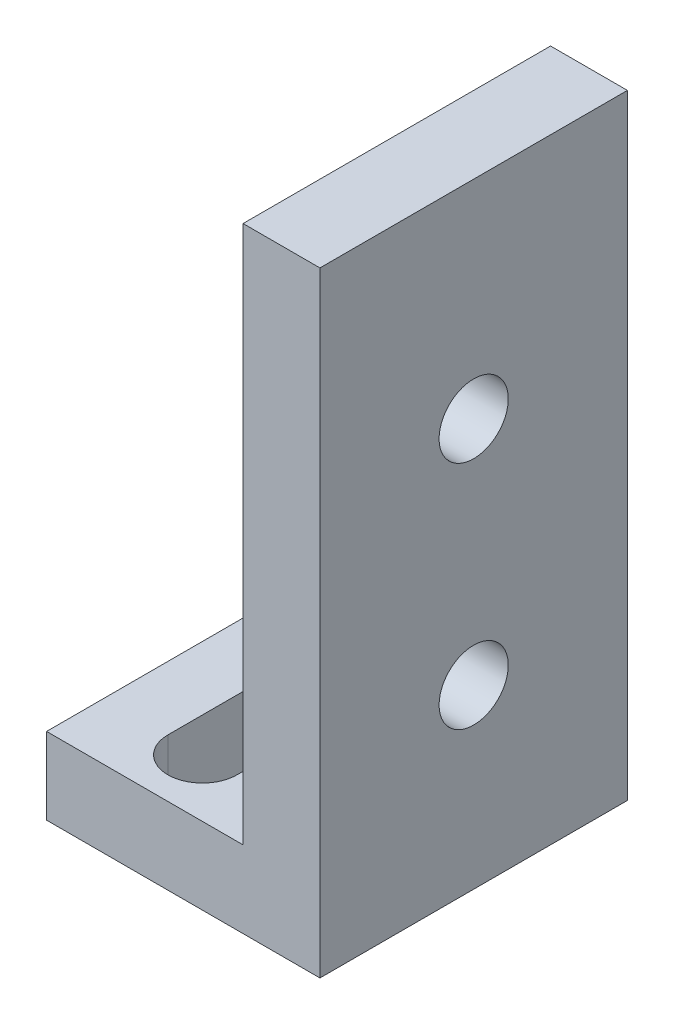
ISO-10303-21;
HEADER;
FILE_DESCRIPTION(('STEP AP214'),'2;1');
FILE_NAME('part.step','',(''),(''),'','','');
FILE_SCHEMA(('AUTOMOTIVE_DESIGN { 1 0 10303 214 1 1 1 1 }'));
ENDSEC;
DATA;
#1=APPLICATION_CONTEXT('core data for automotive mechanical design processes');
#2=APPLICATION_PROTOCOL_DEFINITION('international standard','automotive_design',2000,#1);
#3=PRODUCT_CONTEXT('',#1,'mechanical');
#4=PRODUCT('Part','Part','',(#3));
#5=PRODUCT_RELATED_PRODUCT_CATEGORY('part','',(#4));
#6=PRODUCT_DEFINITION_FORMATION('','',#4);
#7=PRODUCT_DEFINITION_CONTEXT('part definition',#1,'design');
#8=PRODUCT_DEFINITION('design','',#6,#7);
#9=PRODUCT_DEFINITION_SHAPE('','',#8);
#10=(LENGTH_UNIT() NAMED_UNIT(*) SI_UNIT(.MILLI.,.METRE.));
#11=(NAMED_UNIT(*) PLANE_ANGLE_UNIT() SI_UNIT($,.RADIAN.));
#12=(NAMED_UNIT(*) SI_UNIT($,.STERADIAN.) SOLID_ANGLE_UNIT());
#13=UNCERTAINTY_MEASURE_WITH_UNIT(LENGTH_MEASURE(1.E-05),#10,'distance_accuracy_value','');
#14=(GEOMETRIC_REPRESENTATION_CONTEXT(3) GLOBAL_UNCERTAINTY_ASSIGNED_CONTEXT((#13)) GLOBAL_UNIT_ASSIGNED_CONTEXT((#10,
#11,#12)) REPRESENTATION_CONTEXT('',''));
#15=CARTESIAN_POINT('',(0.,0.,0.));
#16=DIRECTION('',(0.,0.,1.));
#17=DIRECTION('',(1.,0.,0.));
#18=AXIS2_PLACEMENT_3D('',#15,#16,#17);
#19=CARTESIAN_POINT('',(17.78,0.,20.));
#20=DIRECTION('',(0.,1.,0.));
#21=DIRECTION('',(-1.,0.,0.));
#22=AXIS2_PLACEMENT_3D('',#19,#20,#21);
#23=PLANE('',#22);
#24=DIRECTION('',(0.,0.,-1.));
#25=VECTOR('',#24,1.);
#26=CARTESIAN_POINT('',(8.63999999999999,0.,3.75));
#27=LINE('',#26,#25);
#28=CARTESIAN_POINT('',(8.64,0.,16.25));
#29=VERTEX_POINT('',#28);
#30=CARTESIAN_POINT('',(8.63999999999999,0.,3.75));
#31=VERTEX_POINT('',#30);
#32=EDGE_CURVE('E127',#29,#31,#27,.T.);
#33=ORIENTED_EDGE('',*,*,#32,.T.);
#34=CARTESIAN_POINT('',(6.39,0.,3.75));
#35=DIRECTION('',(0.,1.,0.));
#36=DIRECTION('',(0.,0.,1.));
#37=AXIS2_PLACEMENT_3D('',#34,#35,#36);
#38=CIRCLE('',#37,2.25);
#39=CARTESIAN_POINT('',(4.14,0.,3.75));
#40=VERTEX_POINT('',#39);
#41=EDGE_CURVE('E120',#31,#40,#38,.T.);
#42=ORIENTED_EDGE('',*,*,#41,.T.);
#43=DIRECTION('',(0.,0.,1.));
#44=VECTOR('',#43,1.);
#45=CARTESIAN_POINT('',(4.14,0.,3.75));
#46=LINE('',#45,#44);
#47=CARTESIAN_POINT('',(4.14000000000001,0.,16.25));
#48=VERTEX_POINT('',#47);
#49=EDGE_CURVE('E130',#40,#48,#46,.T.);
#50=ORIENTED_EDGE('',*,*,#49,.T.);
#51=CARTESIAN_POINT('',(6.39,0.,16.25));
#52=DIRECTION('',(0.,1.,0.));
#53=DIRECTION('',(0.,0.,1.));
#54=AXIS2_PLACEMENT_3D('',#51,#52,#53);
#55=CIRCLE('',#54,2.25);
#56=EDGE_CURVE('E56',#48,#29,#55,.T.);
#57=ORIENTED_EDGE('',*,*,#56,.T.);
#58=EDGE_LOOP('',(#33,#42,#50,#57));
#59=FACE_BOUND('',#58,.T.);
#60=DIRECTION('',(1.,0.,0.));
#61=VECTOR('',#60,1.);
#62=CARTESIAN_POINT('',(17.78,0.,0.));
#63=LINE('',#62,#61);
#64=CARTESIAN_POINT('',(0.,0.,0.));
#65=VERTEX_POINT('',#64);
#66=CARTESIAN_POINT('',(17.78,0.,0.));
#67=VERTEX_POINT('',#66);
#68=EDGE_CURVE('E164',#65,#67,#63,.T.);
#69=ORIENTED_EDGE('',*,*,#68,.T.);
#70=DIRECTION('',(0.,0.,-1.));
#71=VECTOR('',#70,1.);
#72=CARTESIAN_POINT('',(17.78,0.,20.));
#73=LINE('',#72,#71);
#74=CARTESIAN_POINT('',(17.78,0.,20.));
#75=VERTEX_POINT('',#74);
#76=EDGE_CURVE('E11',#75,#67,#73,.T.);
#77=ORIENTED_EDGE('',*,*,#76,.F.);
#78=DIRECTION('',(1.,0.,0.));
#79=VECTOR('',#78,1.);
#80=CARTESIAN_POINT('',(17.78,0.,20.));
#81=LINE('',#80,#79);
#82=CARTESIAN_POINT('',(0.,0.,20.));
#83=VERTEX_POINT('',#82);
#84=EDGE_CURVE('E170',#83,#75,#81,.T.);
#85=ORIENTED_EDGE('',*,*,#84,.F.);
#86=DIRECTION('',(0.,0.,-1.));
#87=VECTOR('',#86,1.);
#88=CARTESIAN_POINT('',(0.,0.,20.));
#89=LINE('',#88,#87);
#90=EDGE_CURVE('E190',#83,#65,#89,.T.);
#91=ORIENTED_EDGE('',*,*,#90,.T.);
#92=EDGE_LOOP('',(#69,#77,#85,#91));
#93=FACE_BOUND('',#92,.T.);
#94=ADVANCED_FACE('F41',(#59,#93),#23,.F.);
#95=CARTESIAN_POINT('',(17.78,40.,20.));
#96=DIRECTION('',(-1.,0.,0.));
#97=DIRECTION('',(0.,-1.,0.));
#98=AXIS2_PLACEMENT_3D('',#95,#96,#97);
#99=PLANE('',#98);
#100=CARTESIAN_POINT('',(17.78,26.5,10.));
#101=DIRECTION('',(-1.,0.,0.));
#102=DIRECTION('',(0.,0.,1.));
#103=AXIS2_PLACEMENT_3D('',#100,#101,#102);
#104=CIRCLE('',#103,2.25);
#105=CARTESIAN_POINT('',(17.78,26.5,12.25));
#106=VERTEX_POINT('',#105);
#107=EDGE_CURVE('E155',#106,#106,#104,.T.);
#108=ORIENTED_EDGE('',*,*,#107,.T.);
#109=EDGE_LOOP('',(#108));
#110=FACE_BOUND('',#109,.T.);
#111=CARTESIAN_POINT('',(17.78,11.5,10.));
#112=DIRECTION('',(-1.,0.,0.));
#113=DIRECTION('',(0.,0.,1.));
#114=AXIS2_PLACEMENT_3D('',#111,#112,#113);
#115=CIRCLE('',#114,2.25);
#116=CARTESIAN_POINT('',(17.78,11.5,12.25));
#117=VERTEX_POINT('',#116);
#118=EDGE_CURVE('E288',#117,#117,#115,.T.);
#119=ORIENTED_EDGE('',*,*,#118,.T.);
#120=EDGE_LOOP('',(#119));
#121=FACE_BOUND('',#120,.T.);
#122=DIRECTION('',(0.,1.,0.));
#123=VECTOR('',#122,1.);
#124=CARTESIAN_POINT('',(17.78,40.,0.));
#125=LINE('',#124,#123);
#126=CARTESIAN_POINT('',(17.78,40.,0.));
#127=VERTEX_POINT('',#126);
#128=EDGE_CURVE('E194',#67,#127,#125,.T.);
#129=ORIENTED_EDGE('',*,*,#128,.T.);
#130=DIRECTION('',(0.,0.,-1.));
#131=VECTOR('',#130,1.);
#132=CARTESIAN_POINT('',(17.78,40.,20.));
#133=LINE('',#132,#131);
#134=CARTESIAN_POINT('',(17.78,40.,20.));
#135=VERTEX_POINT('',#134);
#136=EDGE_CURVE('E49',#135,#127,#133,.T.);
#137=ORIENTED_EDGE('',*,*,#136,.F.);
#138=DIRECTION('',(0.,1.,0.));
#139=VECTOR('',#138,1.);
#140=CARTESIAN_POINT('',(17.78,40.,20.));
#141=LINE('',#140,#139);
#142=EDGE_CURVE('E174',#75,#135,#141,.T.);
#143=ORIENTED_EDGE('',*,*,#142,.F.);
#144=ORIENTED_EDGE('',*,*,#76,.T.);
#145=EDGE_LOOP('',(#129,#137,#143,#144));
#146=FACE_BOUND('',#145,.T.);
#147=ADVANCED_FACE('F251',(#110,#121,#146),#99,.F.);
#148=CARTESIAN_POINT('',(12.78,40.,20.));
#149=DIRECTION('',(0.,-1.,0.));
#150=DIRECTION('',(0.,0.,-1.));
#151=AXIS2_PLACEMENT_3D('',#148,#149,#150);
#152=PLANE('',#151);
#153=DIRECTION('',(-1.,0.,0.));
#154=VECTOR('',#153,1.);
#155=CARTESIAN_POINT('',(12.78,40.,0.));
#156=LINE('',#155,#154);
#157=CARTESIAN_POINT('',(12.78,40.,0.));
#158=VERTEX_POINT('',#157);
#159=EDGE_CURVE('E197',#127,#158,#156,.T.);
#160=ORIENTED_EDGE('',*,*,#159,.T.);
#161=DIRECTION('',(0.,0.,-1.));
#162=VECTOR('',#161,1.);
#163=CARTESIAN_POINT('',(12.78,40.,20.));
#164=LINE('',#163,#162);
#165=CARTESIAN_POINT('',(12.78,40.,20.));
#166=VERTEX_POINT('',#165);
#167=EDGE_CURVE('E219',#166,#158,#164,.T.);
#168=ORIENTED_EDGE('',*,*,#167,.F.);
#169=DIRECTION('',(-1.,0.,0.));
#170=VECTOR('',#169,1.);
#171=CARTESIAN_POINT('',(12.78,40.,20.));
#172=LINE('',#171,#170);
#173=EDGE_CURVE('E178',#135,#166,#172,.T.);
#174=ORIENTED_EDGE('',*,*,#173,.F.);
#175=ORIENTED_EDGE('',*,*,#136,.T.);
#176=EDGE_LOOP('',(#160,#168,#174,#175));
#177=FACE_BOUND('',#176,.T.);
#178=ADVANCED_FACE('F228',(#177),#152,.F.);
#179=CARTESIAN_POINT('',(12.78,5.,20.));
#180=DIRECTION('',(1.,0.,0.));
#181=DIRECTION('',(0.,0.,-1.));
#182=AXIS2_PLACEMENT_3D('',#179,#180,#181);
#183=PLANE('',#182);
#184=CARTESIAN_POINT('',(12.78,26.5,10.));
#185=DIRECTION('',(-1.,0.,0.));
#186=DIRECTION('',(0.,0.,1.));
#187=AXIS2_PLACEMENT_3D('',#184,#185,#186);
#188=CIRCLE('',#187,2.25);
#189=CARTESIAN_POINT('',(12.78,26.5,12.25));
#190=VERTEX_POINT('',#189);
#191=EDGE_CURVE('E283',#190,#190,#188,.T.);
#192=ORIENTED_EDGE('',*,*,#191,.F.);
#193=EDGE_LOOP('',(#192));
#194=FACE_BOUND('',#193,.T.);
#195=CARTESIAN_POINT('',(12.78,11.5,10.));
#196=DIRECTION('',(-1.,0.,0.));
#197=DIRECTION('',(0.,0.,1.));
#198=AXIS2_PLACEMENT_3D('',#195,#196,#197);
#199=CIRCLE('',#198,2.25);
#200=CARTESIAN_POINT('',(12.78,11.5,12.25));
#201=VERTEX_POINT('',#200);
#202=EDGE_CURVE('E145',#201,#201,#199,.T.);
#203=ORIENTED_EDGE('',*,*,#202,.F.);
#204=EDGE_LOOP('',(#203));
#205=FACE_BOUND('',#204,.T.);
#206=DIRECTION('',(0.,-1.,0.));
#207=VECTOR('',#206,1.);
#208=CARTESIAN_POINT('',(12.78,5.,0.));
#209=LINE('',#208,#207);
#210=CARTESIAN_POINT('',(12.78,5.,0.));
#211=VERTEX_POINT('',#210);
#212=EDGE_CURVE('E200',#158,#211,#209,.T.);
#213=ORIENTED_EDGE('',*,*,#212,.T.);
#214=DIRECTION('',(0.,0.,-1.));
#215=VECTOR('',#214,1.);
#216=CARTESIAN_POINT('',(12.78,5.,20.));
#217=LINE('',#216,#215);
#218=CARTESIAN_POINT('',(12.78,5.,20.));
#219=VERTEX_POINT('',#218);
#220=EDGE_CURVE('E215',#219,#211,#217,.T.);
#221=ORIENTED_EDGE('',*,*,#220,.F.);
#222=DIRECTION('',(0.,-1.,0.));
#223=VECTOR('',#222,1.);
#224=CARTESIAN_POINT('',(12.78,5.,20.));
#225=LINE('',#224,#223);
#226=EDGE_CURVE('E181',#166,#219,#225,.T.);
#227=ORIENTED_EDGE('',*,*,#226,.F.);
#228=ORIENTED_EDGE('',*,*,#167,.T.);
#229=EDGE_LOOP('',(#213,#221,#227,#228));
#230=FACE_BOUND('',#229,.T.);
#231=ADVANCED_FACE('F239',(#194,#205,#230),#183,.F.);
#232=CARTESIAN_POINT('',(0.,5.,20.));
#233=DIRECTION('',(0.,-1.,0.));
#234=DIRECTION('',(0.,0.,-1.));
#235=AXIS2_PLACEMENT_3D('',#232,#233,#234);
#236=PLANE('',#235);
#237=DIRECTION('',(0.,0.,1.));
#238=VECTOR('',#237,1.);
#239=CARTESIAN_POINT('',(4.14,5.,3.75));
#240=LINE('',#239,#238);
#241=CARTESIAN_POINT('',(4.14,5.,3.75));
#242=VERTEX_POINT('',#241);
#243=CARTESIAN_POINT('',(4.14000000000001,5.,16.25));
#244=VERTEX_POINT('',#243);
#245=EDGE_CURVE('E154',#242,#244,#240,.T.);
#246=ORIENTED_EDGE('',*,*,#245,.F.);
#247=CARTESIAN_POINT('',(6.39,5.,3.75));
#248=DIRECTION('',(0.,1.,0.));
#249=DIRECTION('',(0.,0.,1.));
#250=AXIS2_PLACEMENT_3D('',#247,#248,#249);
#251=CIRCLE('',#250,2.25);
#252=CARTESIAN_POINT('',(8.63999999999999,5.,3.75));
#253=VERTEX_POINT('',#252);
#254=EDGE_CURVE('E64',#253,#242,#251,.T.);
#255=ORIENTED_EDGE('',*,*,#254,.F.);
#256=DIRECTION('',(0.,0.,-1.));
#257=VECTOR('',#256,1.);
#258=CARTESIAN_POINT('',(8.63999999999999,5.,3.75));
#259=LINE('',#258,#257);
#260=CARTESIAN_POINT('',(8.64,5.,16.25));
#261=VERTEX_POINT('',#260);
#262=EDGE_CURVE('E138',#261,#253,#259,.T.);
#263=ORIENTED_EDGE('',*,*,#262,.F.);
#264=CARTESIAN_POINT('',(6.39,5.,16.25));
#265=DIRECTION('',(0.,1.,0.));
#266=DIRECTION('',(0.,0.,1.));
#267=AXIS2_PLACEMENT_3D('',#264,#265,#266);
#268=CIRCLE('',#267,2.25);
#269=EDGE_CURVE('E142',#244,#261,#268,.T.);
#270=ORIENTED_EDGE('',*,*,#269,.F.);
#271=EDGE_LOOP('',(#246,#255,#263,#270));
#272=FACE_BOUND('',#271,.T.);
#273=DIRECTION('',(-1.,0.,0.));
#274=VECTOR('',#273,1.);
#275=CARTESIAN_POINT('',(0.,5.,0.));
#276=LINE('',#275,#274);
#277=CARTESIAN_POINT('',(0.,5.,0.));
#278=VERTEX_POINT('',#277);
#279=EDGE_CURVE('E203',#211,#278,#276,.T.);
#280=ORIENTED_EDGE('',*,*,#279,.T.);
#281=DIRECTION('',(0.,0.,-1.));
#282=VECTOR('',#281,1.);
#283=CARTESIAN_POINT('',(0.,5.,20.));
#284=LINE('',#283,#282);
#285=CARTESIAN_POINT('',(0.,5.,20.));
#286=VERTEX_POINT('',#285);
#287=EDGE_CURVE('E211',#286,#278,#284,.T.);
#288=ORIENTED_EDGE('',*,*,#287,.F.);
#289=DIRECTION('',(-1.,0.,0.));
#290=VECTOR('',#289,1.);
#291=CARTESIAN_POINT('',(0.,5.,20.));
#292=LINE('',#291,#290);
#293=EDGE_CURVE('E184',#219,#286,#292,.T.);
#294=ORIENTED_EDGE('',*,*,#293,.F.);
#295=ORIENTED_EDGE('',*,*,#220,.T.);
#296=EDGE_LOOP('',(#280,#288,#294,#295));
#297=FACE_BOUND('',#296,.T.);
#298=ADVANCED_FACE('F243',(#272,#297),#236,.F.);
#299=CARTESIAN_POINT('',(0.,0.,20.));
#300=DIRECTION('',(1.,0.,0.));
#301=DIRECTION('',(0.,0.,-1.));
#302=AXIS2_PLACEMENT_3D('',#299,#300,#301);
#303=PLANE('',#302);
#304=DIRECTION('',(0.,-1.,0.));
#305=VECTOR('',#304,1.);
#306=CARTESIAN_POINT('',(0.,0.,0.));
#307=LINE('',#306,#305);
#308=EDGE_CURVE('E175',#278,#65,#307,.T.);
#309=ORIENTED_EDGE('',*,*,#308,.T.);
#310=ORIENTED_EDGE('',*,*,#90,.F.);
#311=DIRECTION('',(0.,-1.,0.));
#312=VECTOR('',#311,1.);
#313=CARTESIAN_POINT('',(0.,0.,20.));
#314=LINE('',#313,#312);
#315=EDGE_CURVE('E187',#286,#83,#314,.T.);
#316=ORIENTED_EDGE('',*,*,#315,.F.);
#317=ORIENTED_EDGE('',*,*,#287,.T.);
#318=EDGE_LOOP('',(#309,#310,#316,#317));
#319=FACE_BOUND('',#318,.T.);
#320=ADVANCED_FACE('F253',(#319),#303,.F.);
#321=CARTESIAN_POINT('',(0.,0.,20.));
#322=DIRECTION('',(0.,0.,-1.));
#323=DIRECTION('',(-1.,0.,0.));
#324=AXIS2_PLACEMENT_3D('',#321,#322,#323);
#325=PLANE('',#324);
#326=ORIENTED_EDGE('',*,*,#84,.T.);
#327=ORIENTED_EDGE('',*,*,#142,.T.);
#328=ORIENTED_EDGE('',*,*,#173,.T.);
#329=ORIENTED_EDGE('',*,*,#226,.T.);
#330=ORIENTED_EDGE('',*,*,#293,.T.);
#331=ORIENTED_EDGE('',*,*,#315,.T.);
#332=EDGE_LOOP('',(#326,#327,#328,#329,#330,#331));
#333=FACE_BOUND('',#332,.T.);
#334=ADVANCED_FACE('F247',(#333),#325,.F.);
#335=CARTESIAN_POINT('',(0.,0.,0.));
#336=DIRECTION('',(0.,0.,-1.));
#337=DIRECTION('',(-1.,0.,0.));
#338=AXIS2_PLACEMENT_3D('',#335,#336,#337);
#339=PLANE('',#338);
#340=ORIENTED_EDGE('',*,*,#68,.F.);
#341=ORIENTED_EDGE('',*,*,#308,.F.);
#342=ORIENTED_EDGE('',*,*,#279,.F.);
#343=ORIENTED_EDGE('',*,*,#212,.F.);
#344=ORIENTED_EDGE('',*,*,#159,.F.);
#345=ORIENTED_EDGE('',*,*,#128,.F.);
#346=EDGE_LOOP('',(#340,#341,#342,#343,#344,#345));
#347=FACE_BOUND('',#346,.T.);
#348=ADVANCED_FACE('F234',(#347),#339,.T.);
#349=CARTESIAN_POINT('',(6.39,0.,3.75));
#350=DIRECTION('',(0.,1.,0.));
#351=DIRECTION('',(0.,0.,1.));
#352=AXIS2_PLACEMENT_3D('',#349,#350,#351);
#353=CYLINDRICAL_SURFACE('',#352,2.25);
#354=ORIENTED_EDGE('',*,*,#254,.T.);
#355=DIRECTION('',(0.,1.,0.));
#356=VECTOR('',#355,1.);
#357=CARTESIAN_POINT('',(4.14,0.,3.75));
#358=LINE('',#357,#356);
#359=EDGE_CURVE('E116',#40,#242,#358,.T.);
#360=ORIENTED_EDGE('',*,*,#359,.F.);
#361=ORIENTED_EDGE('',*,*,#41,.F.);
#362=DIRECTION('',(0.,1.,0.));
#363=VECTOR('',#362,1.);
#364=CARTESIAN_POINT('',(8.63999999999999,0.,3.75));
#365=LINE('',#364,#363);
#366=EDGE_CURVE('E161',#31,#253,#365,.T.);
#367=ORIENTED_EDGE('',*,*,#366,.T.);
#368=EDGE_LOOP('',(#354,#360,#361,#367));
#369=FACE_BOUND('',#368,.T.);
#370=ADVANCED_FACE('F118',(#369),#353,.F.);
#371=CARTESIAN_POINT('',(8.63999999999999,0.,3.75));
#372=DIRECTION('',(1.,0.,0.));
#373=DIRECTION('',(0.,0.,-1.));
#374=AXIS2_PLACEMENT_3D('',#371,#372,#373);
#375=PLANE('',#374);
#376=ORIENTED_EDGE('',*,*,#262,.T.);
#377=ORIENTED_EDGE('',*,*,#366,.F.);
#378=ORIENTED_EDGE('',*,*,#32,.F.);
#379=DIRECTION('',(0.,1.,0.));
#380=VECTOR('',#379,1.);
#381=CARTESIAN_POINT('',(8.64,0.,16.25));
#382=LINE('',#381,#380);
#383=EDGE_CURVE('E165',#29,#261,#382,.T.);
#384=ORIENTED_EDGE('',*,*,#383,.T.);
#385=EDGE_LOOP('',(#376,#377,#378,#384));
#386=FACE_BOUND('',#385,.T.);
#387=ADVANCED_FACE('F309',(#386),#375,.F.);
#388=CARTESIAN_POINT('',(6.39,0.,16.25));
#389=DIRECTION('',(0.,1.,0.));
#390=DIRECTION('',(0.,0.,1.));
#391=AXIS2_PLACEMENT_3D('',#388,#389,#390);
#392=CYLINDRICAL_SURFACE('',#391,2.25);
#393=ORIENTED_EDGE('',*,*,#269,.T.);
#394=ORIENTED_EDGE('',*,*,#383,.F.);
#395=ORIENTED_EDGE('',*,*,#56,.F.);
#396=DIRECTION('',(0.,1.,0.));
#397=VECTOR('',#396,1.);
#398=CARTESIAN_POINT('',(4.14000000000001,0.,16.25));
#399=LINE('',#398,#397);
#400=EDGE_CURVE('E126',#48,#244,#399,.T.);
#401=ORIENTED_EDGE('',*,*,#400,.T.);
#402=EDGE_LOOP('',(#393,#394,#395,#401));
#403=FACE_BOUND('',#402,.T.);
#404=ADVANCED_FACE('F312',(#403),#392,.F.);
#405=CARTESIAN_POINT('',(4.14,0.,3.75));
#406=DIRECTION('',(-1.,0.,0.));
#407=DIRECTION('',(0.,0.,1.));
#408=AXIS2_PLACEMENT_3D('',#405,#406,#407);
#409=PLANE('',#408);
#410=ORIENTED_EDGE('',*,*,#245,.T.);
#411=ORIENTED_EDGE('',*,*,#400,.F.);
#412=ORIENTED_EDGE('',*,*,#49,.F.);
#413=ORIENTED_EDGE('',*,*,#359,.T.);
#414=EDGE_LOOP('',(#410,#411,#412,#413));
#415=FACE_BOUND('',#414,.T.);
#416=ADVANCED_FACE('F131',(#415),#409,.F.);
#417=CARTESIAN_POINT('',(17.78,11.5,10.));
#418=DIRECTION('',(-1.,0.,0.));
#419=DIRECTION('',(0.,0.,1.));
#420=AXIS2_PLACEMENT_3D('',#417,#418,#419);
#421=CYLINDRICAL_SURFACE('',#420,2.25);
#422=ORIENTED_EDGE('',*,*,#118,.F.);
#423=EDGE_LOOP('',(#422));
#424=FACE_BOUND('',#423,.T.);
#425=ORIENTED_EDGE('',*,*,#202,.T.);
#426=EDGE_LOOP('',(#425));
#427=FACE_BOUND('',#426,.T.);
#428=ADVANCED_FACE('F301',(#424,#427),#421,.F.);
#429=CARTESIAN_POINT('',(17.78,26.5,10.));
#430=DIRECTION('',(-1.,0.,0.));
#431=DIRECTION('',(0.,0.,1.));
#432=AXIS2_PLACEMENT_3D('',#429,#430,#431);
#433=CYLINDRICAL_SURFACE('',#432,2.25);
#434=ORIENTED_EDGE('',*,*,#107,.F.);
#435=EDGE_LOOP('',(#434));
#436=FACE_BOUND('',#435,.T.);
#437=ORIENTED_EDGE('',*,*,#191,.T.);
#438=EDGE_LOOP('',(#437));
#439=FACE_BOUND('',#438,.T.);
#440=ADVANCED_FACE('F298',(#436,#439),#433,.F.);
#441=CLOSED_SHELL('',(#94,#147,#178,#231,#298,#320,#334,#348,#370,#387,#404,#416,#428,#440));
#442=MANIFOLD_SOLID_BREP('B2',#441);
#443=ADVANCED_BREP_SHAPE_REPRESENTATION('',(#18,#442),#14);
#444=SHAPE_DEFINITION_REPRESENTATION(#9,#443);
ENDSEC;
END-ISO-10303-21;
